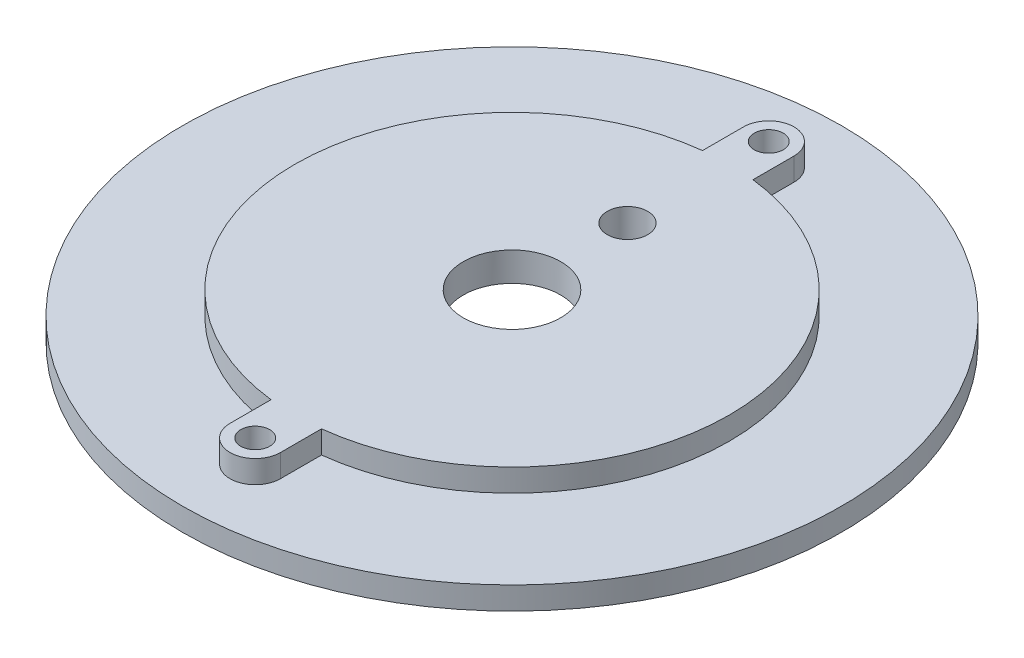
ISO-10303-21;
HEADER;
FILE_DESCRIPTION(('STEP AP214'),'2;1');
FILE_NAME('part.step','',(''),(''),'','','');
FILE_SCHEMA(('AUTOMOTIVE_DESIGN { 1 0 10303 214 1 1 1 1 }'));
ENDSEC;
DATA;
#1=APPLICATION_CONTEXT('core data for automotive mechanical design processes');
#2=APPLICATION_PROTOCOL_DEFINITION('international standard','automotive_design',2000,#1);
#3=PRODUCT_CONTEXT('',#1,'mechanical');
#4=PRODUCT('Part','Part','',(#3));
#5=PRODUCT_RELATED_PRODUCT_CATEGORY('part','',(#4));
#6=PRODUCT_DEFINITION_FORMATION('','',#4);
#7=PRODUCT_DEFINITION_CONTEXT('part definition',#1,'design');
#8=PRODUCT_DEFINITION('design','',#6,#7);
#9=PRODUCT_DEFINITION_SHAPE('','',#8);
#10=(LENGTH_UNIT() NAMED_UNIT(*) SI_UNIT(.MILLI.,.METRE.));
#11=(NAMED_UNIT(*) PLANE_ANGLE_UNIT() SI_UNIT($,.RADIAN.));
#12=(NAMED_UNIT(*) SI_UNIT($,.STERADIAN.) SOLID_ANGLE_UNIT());
#13=UNCERTAINTY_MEASURE_WITH_UNIT(LENGTH_MEASURE(1.E-05),#10,'distance_accuracy_value','');
#14=(GEOMETRIC_REPRESENTATION_CONTEXT(3) GLOBAL_UNCERTAINTY_ASSIGNED_CONTEXT((#13)) GLOBAL_UNIT_ASSIGNED_CONTEXT((#10,
#11,#12)) REPRESENTATION_CONTEXT('',''));
#15=CARTESIAN_POINT('',(0.,0.,0.));
#16=DIRECTION('',(0.,0.,1.));
#17=DIRECTION('',(1.,0.,0.));
#18=AXIS2_PLACEMENT_3D('',#15,#16,#17);
#19=CARTESIAN_POINT('',(0.,-1.961,0.));
#20=DIRECTION('',(0.,1.,0.));
#21=DIRECTION('',(0.,0.,1.));
#22=AXIS2_PLACEMENT_3D('',#19,#20,#21);
#23=CYLINDRICAL_SURFACE('',#22,4.205);
#24=CARTESIAN_POINT('',(0.,1.96,0.));
#25=DIRECTION('',(0.,1.,0.));
#26=DIRECTION('',(0.,0.,1.));
#27=AXIS2_PLACEMENT_3D('',#24,#25,#26);
#28=CIRCLE('',#27,4.205);
#29=CARTESIAN_POINT('',(0.,1.96,4.205));
#30=VERTEX_POINT('',#29);
#31=EDGE_CURVE('E258',#30,#30,#28,.T.);
#32=ORIENTED_EDGE('',*,*,#31,.T.);
#33=EDGE_LOOP('',(#32));
#34=FACE_BOUND('',#33,.T.);
#35=CARTESIAN_POINT('',(0.,-0.54,0.));
#36=DIRECTION('',(0.,-1.,0.));
#37=DIRECTION('',(0.,0.,-1.));
#38=AXIS2_PLACEMENT_3D('',#35,#36,#37);
#39=CIRCLE('',#38,4.205);
#40=CARTESIAN_POINT('',(0.,-0.54,-4.205));
#41=VERTEX_POINT('',#40);
#42=EDGE_CURVE('E42',#41,#41,#39,.F.);
#43=ORIENTED_EDGE('',*,*,#42,.F.);
#44=EDGE_LOOP('',(#43));
#45=FACE_BOUND('',#44,.T.);
#46=ADVANCED_FACE('F38',(#34,#45),#23,.F.);
#47=CARTESIAN_POINT('',(-2.18000000000007,1.96,-22.175));
#48=DIRECTION('',(1.,0.,0.));
#49=DIRECTION('',(0.,0.,-1.));
#50=AXIS2_PLACEMENT_3D('',#47,#48,#49);
#51=PLANE('',#50);
#52=DIRECTION('',(0.,0.,1.));
#53=VECTOR('',#52,1.);
#54=CARTESIAN_POINT('',(-2.18000000000007,1.96,-22.175));
#55=LINE('',#54,#53);
#56=CARTESIAN_POINT('',(-2.18000000000007,1.96,18.6329063755497));
#57=VERTEX_POINT('',#56);
#58=CARTESIAN_POINT('',(-2.18000000000007,1.96,22.175));
#59=VERTEX_POINT('',#58);
#60=EDGE_CURVE('E183',#57,#59,#55,.T.);
#61=ORIENTED_EDGE('',*,*,#60,.F.);
#62=DIRECTION('',(0.,-1.,0.));
#63=VECTOR('',#62,1.);
#64=CARTESIAN_POINT('',(-2.18000000000007,1.96,18.6329063755497));
#65=LINE('',#64,#63);
#66=CARTESIAN_POINT('',(-2.18000000000007,0.,18.6329063755497));
#67=VERTEX_POINT('',#66);
#68=EDGE_CURVE('E130',#57,#67,#65,.T.);
#69=ORIENTED_EDGE('',*,*,#68,.T.);
#70=DIRECTION('',(0.,0.,1.));
#71=VECTOR('',#70,1.);
#72=CARTESIAN_POINT('',(-2.18000000000007,0.,-22.175));
#73=LINE('',#72,#71);
#74=CARTESIAN_POINT('',(-2.18000000000007,0.,22.175));
#75=VERTEX_POINT('',#74);
#76=EDGE_CURVE('E142',#67,#75,#73,.T.);
#77=ORIENTED_EDGE('',*,*,#76,.T.);
#78=DIRECTION('',(0.,-1.,0.));
#79=VECTOR('',#78,1.);
#80=CARTESIAN_POINT('',(-2.18000000000007,1.96,22.175));
#81=LINE('',#80,#79);
#82=EDGE_CURVE('E48',#59,#75,#81,.T.);
#83=ORIENTED_EDGE('',*,*,#82,.F.);
#84=EDGE_LOOP('',(#61,#69,#77,#83));
#85=FACE_BOUND('',#84,.T.);
#86=ADVANCED_FACE('F199',(#85),#51,.F.);
#87=CARTESIAN_POINT('',(2.18000000000007,1.96,22.175));
#88=DIRECTION('',(-1.,0.,0.));
#89=DIRECTION('',(0.,0.,1.));
#90=AXIS2_PLACEMENT_3D('',#87,#88,#89);
#91=PLANE('',#90);
#92=DIRECTION('',(0.,0.,-1.));
#93=VECTOR('',#92,1.);
#94=CARTESIAN_POINT('',(2.18000000000007,1.96,22.175));
#95=LINE('',#94,#93);
#96=CARTESIAN_POINT('',(2.18000000000007,1.96,-18.6329063755497));
#97=VERTEX_POINT('',#96);
#98=CARTESIAN_POINT('',(2.18000000000007,1.96,-22.175));
#99=VERTEX_POINT('',#98);
#100=EDGE_CURVE('E56',#97,#99,#95,.T.);
#101=ORIENTED_EDGE('',*,*,#100,.F.);
#102=DIRECTION('',(0.,-1.,0.));
#103=VECTOR('',#102,1.);
#104=CARTESIAN_POINT('',(2.18000000000007,1.96,-18.6329063755497));
#105=LINE('',#104,#103);
#106=CARTESIAN_POINT('',(2.18000000000007,0.,-18.6329063755497));
#107=VERTEX_POINT('',#106);
#108=EDGE_CURVE('E119',#97,#107,#105,.T.);
#109=ORIENTED_EDGE('',*,*,#108,.T.);
#110=DIRECTION('',(0.,0.,-1.));
#111=VECTOR('',#110,1.);
#112=CARTESIAN_POINT('',(2.18000000000007,0.,22.175));
#113=LINE('',#112,#111);
#114=CARTESIAN_POINT('',(2.18000000000007,0.,-22.175));
#115=VERTEX_POINT('',#114);
#116=EDGE_CURVE('E117',#107,#115,#113,.T.);
#117=ORIENTED_EDGE('',*,*,#116,.T.);
#118=DIRECTION('',(0.,-1.,0.));
#119=VECTOR('',#118,1.);
#120=CARTESIAN_POINT('',(2.18000000000007,1.96,-22.175));
#121=LINE('',#120,#119);
#122=EDGE_CURVE('E106',#99,#115,#121,.T.);
#123=ORIENTED_EDGE('',*,*,#122,.F.);
#124=EDGE_LOOP('',(#101,#109,#117,#123));
#125=FACE_BOUND('',#124,.T.);
#126=ADVANCED_FACE('F118',(#125),#91,.F.);
#127=CARTESIAN_POINT('',(0.,1.96,-22.175));
#128=DIRECTION('',(0.,-1.,0.));
#129=DIRECTION('',(0.,0.,-1.));
#130=AXIS2_PLACEMENT_3D('',#127,#128,#129);
#131=CYLINDRICAL_SURFACE('',#130,2.18000000000007);
#132=CARTESIAN_POINT('',(0.,0.,-22.175));
#133=DIRECTION('',(0.,-1.,0.));
#134=DIRECTION('',(0.,0.,-1.));
#135=AXIS2_PLACEMENT_3D('',#132,#133,#134);
#136=CIRCLE('',#135,2.18000000000007);
#137=CARTESIAN_POINT('',(-2.18000000000007,0.,-22.175));
#138=VERTEX_POINT('',#137);
#139=EDGE_CURVE('E109',#138,#115,#136,.T.);
#140=ORIENTED_EDGE('',*,*,#139,.F.);
#141=DIRECTION('',(0.,-1.,0.));
#142=VECTOR('',#141,1.);
#143=CARTESIAN_POINT('',(-2.18000000000007,1.96,-22.175));
#144=LINE('',#143,#142);
#145=CARTESIAN_POINT('',(-2.18000000000007,1.96,-22.175));
#146=VERTEX_POINT('',#145);
#147=EDGE_CURVE('E11',#146,#138,#144,.T.);
#148=ORIENTED_EDGE('',*,*,#147,.F.);
#149=CARTESIAN_POINT('',(0.,1.96,-22.175));
#150=DIRECTION('',(0.,-1.,0.));
#151=DIRECTION('',(0.,0.,-1.));
#152=AXIS2_PLACEMENT_3D('',#149,#150,#151);
#153=CIRCLE('',#152,2.18000000000007);
#154=EDGE_CURVE('E112',#146,#99,#153,.T.);
#155=ORIENTED_EDGE('',*,*,#154,.T.);
#156=ORIENTED_EDGE('',*,*,#122,.T.);
#157=EDGE_LOOP('',(#140,#148,#155,#156));
#158=FACE_BOUND('',#157,.T.);
#159=ADVANCED_FACE('F40',(#158),#131,.T.);
#160=CARTESIAN_POINT('',(-2.18000000000007,0.,-18.6329063755497));
#161=VERTEX_POINT('',#160);
#162=EDGE_CURVE('E128',#138,#161,#73,.T.);
#163=ORIENTED_EDGE('',*,*,#162,.T.);
#164=DIRECTION('',(0.,-1.,0.));
#165=VECTOR('',#164,1.);
#166=CARTESIAN_POINT('',(-2.18000000000007,1.96,-18.6329063755497));
#167=LINE('',#166,#165);
#168=CARTESIAN_POINT('',(-2.18000000000007,1.96,-18.6329063755497));
#169=VERTEX_POINT('',#168);
#170=EDGE_CURVE('E133',#161,#169,#167,.F.);
#171=ORIENTED_EDGE('',*,*,#170,.T.);
#172=EDGE_CURVE('E115',#146,#169,#55,.T.);
#173=ORIENTED_EDGE('',*,*,#172,.F.);
#174=ORIENTED_EDGE('',*,*,#147,.T.);
#175=EDGE_LOOP('',(#163,#171,#173,#174));
#176=FACE_BOUND('',#175,.T.);
#177=ADVANCED_FACE('F202',(#176),#51,.F.);
#178=CARTESIAN_POINT('',(0.,1.96,22.175));
#179=DIRECTION('',(0.,-1.,0.));
#180=DIRECTION('',(0.,0.,-1.));
#181=AXIS2_PLACEMENT_3D('',#178,#179,#180);
#182=CYLINDRICAL_SURFACE('',#181,2.18000000000007);
#183=CARTESIAN_POINT('',(0.,0.,22.175));
#184=DIRECTION('',(0.,1.,0.));
#185=DIRECTION('',(0.,0.,1.));
#186=AXIS2_PLACEMENT_3D('',#183,#184,#185);
#187=CIRCLE('',#186,2.18000000000007);
#188=CARTESIAN_POINT('',(2.18000000000007,0.,22.175));
#189=VERTEX_POINT('',#188);
#190=EDGE_CURVE('E139',#75,#189,#187,.T.);
#191=ORIENTED_EDGE('',*,*,#190,.T.);
#192=DIRECTION('',(0.,-1.,0.));
#193=VECTOR('',#192,1.);
#194=CARTESIAN_POINT('',(2.18000000000007,1.96,22.175));
#195=LINE('',#194,#193);
#196=CARTESIAN_POINT('',(2.18000000000007,1.96,22.175));
#197=VERTEX_POINT('',#196);
#198=EDGE_CURVE('E114',#197,#189,#195,.T.);
#199=ORIENTED_EDGE('',*,*,#198,.F.);
#200=CARTESIAN_POINT('',(0.,1.96,22.175));
#201=DIRECTION('',(0.,1.,0.));
#202=DIRECTION('',(0.,0.,1.));
#203=AXIS2_PLACEMENT_3D('',#200,#201,#202);
#204=CIRCLE('',#203,2.18000000000007);
#205=EDGE_CURVE('E181',#59,#197,#204,.T.);
#206=ORIENTED_EDGE('',*,*,#205,.F.);
#207=ORIENTED_EDGE('',*,*,#82,.T.);
#208=EDGE_LOOP('',(#191,#199,#206,#207));
#209=FACE_BOUND('',#208,.T.);
#210=ADVANCED_FACE('F200',(#209),#182,.T.);
#211=CARTESIAN_POINT('',(2.18000000000007,0.,18.6329063755497));
#212=VERTEX_POINT('',#211);
#213=EDGE_CURVE('E124',#189,#212,#113,.T.);
#214=ORIENTED_EDGE('',*,*,#213,.T.);
#215=DIRECTION('',(0.,-1.,0.));
#216=VECTOR('',#215,1.);
#217=CARTESIAN_POINT('',(2.18000000000007,1.96,18.6329063755497));
#218=LINE('',#217,#216);
#219=CARTESIAN_POINT('',(2.18000000000007,1.96,18.6329063755497));
#220=VERTEX_POINT('',#219);
#221=EDGE_CURVE('E64',#212,#220,#218,.F.);
#222=ORIENTED_EDGE('',*,*,#221,.T.);
#223=EDGE_CURVE('E153',#197,#220,#95,.T.);
#224=ORIENTED_EDGE('',*,*,#223,.F.);
#225=ORIENTED_EDGE('',*,*,#198,.T.);
#226=EDGE_LOOP('',(#214,#222,#224,#225));
#227=FACE_BOUND('',#226,.T.);
#228=ADVANCED_FACE('F152',(#227),#91,.F.);
#229=CARTESIAN_POINT('',(0.,1.96,-22.175));
#230=DIRECTION('',(0.,-1.,0.));
#231=DIRECTION('',(0.,0.,-1.));
#232=AXIS2_PLACEMENT_3D('',#229,#230,#231);
#233=PLANE('',#232);
#234=ORIENTED_EDGE('',*,*,#31,.F.);
#235=EDGE_LOOP('',(#234));
#236=FACE_BOUND('',#235,.T.);
#237=CARTESIAN_POINT('',(0.,1.96,-9.975));
#238=DIRECTION('',(0.,1.,0.));
#239=DIRECTION('',(0.,0.,1.));
#240=AXIS2_PLACEMENT_3D('',#237,#238,#239);
#241=CIRCLE('',#240,1.75);
#242=CARTESIAN_POINT('',(0.,1.96,-8.225));
#243=VERTEX_POINT('',#242);
#244=EDGE_CURVE('E262',#243,#243,#241,.T.);
#245=ORIENTED_EDGE('',*,*,#244,.F.);
#246=EDGE_LOOP('',(#245));
#247=FACE_BOUND('',#246,.T.);
#248=CARTESIAN_POINT('',(0.,1.96,-22.175));
#249=DIRECTION('',(0.,1.,0.));
#250=DIRECTION('',(0.,0.,1.));
#251=AXIS2_PLACEMENT_3D('',#248,#249,#250);
#252=CIRCLE('',#251,1.25);
#253=CARTESIAN_POINT('',(0.,1.96,-20.925));
#254=VERTEX_POINT('',#253);
#255=EDGE_CURVE('E266',#254,#254,#252,.T.);
#256=ORIENTED_EDGE('',*,*,#255,.F.);
#257=EDGE_LOOP('',(#256));
#258=FACE_BOUND('',#257,.T.);
#259=CARTESIAN_POINT('',(0.,1.96,22.175));
#260=DIRECTION('',(0.,1.,0.));
#261=DIRECTION('',(0.,0.,1.));
#262=AXIS2_PLACEMENT_3D('',#259,#260,#261);
#263=CIRCLE('',#262,1.25);
#264=CARTESIAN_POINT('',(0.,1.96,23.425));
#265=VERTEX_POINT('',#264);
#266=EDGE_CURVE('E269',#265,#265,#263,.T.);
#267=ORIENTED_EDGE('',*,*,#266,.F.);
#268=EDGE_LOOP('',(#267));
#269=FACE_BOUND('',#268,.T.);
#270=ORIENTED_EDGE('',*,*,#172,.T.);
#271=CARTESIAN_POINT('',(0.,1.96,0.));
#272=DIRECTION('',(0.,-1.,0.));
#273=DIRECTION('',(0.,0.,-1.));
#274=AXIS2_PLACEMENT_3D('',#271,#272,#273);
#275=CIRCLE('',#274,18.76);
#276=EDGE_CURVE('E161',#57,#169,#275,.T.);
#277=ORIENTED_EDGE('',*,*,#276,.F.);
#278=ORIENTED_EDGE('',*,*,#60,.T.);
#279=ORIENTED_EDGE('',*,*,#205,.T.);
#280=ORIENTED_EDGE('',*,*,#223,.T.);
#281=EDGE_CURVE('E167',#97,#220,#275,.T.);
#282=ORIENTED_EDGE('',*,*,#281,.F.);
#283=ORIENTED_EDGE('',*,*,#100,.T.);
#284=ORIENTED_EDGE('',*,*,#154,.F.);
#285=EDGE_LOOP('',(#270,#277,#278,#279,#280,#282,#283,#284));
#286=FACE_BOUND('',#285,.T.);
#287=ADVANCED_FACE('F191',(#236,#247,#258,#269,#286),#233,.F.);
#288=CARTESIAN_POINT('',(0.,1.96,0.));
#289=DIRECTION('',(0.,-1.,0.));
#290=DIRECTION('',(0.,0.,-1.));
#291=AXIS2_PLACEMENT_3D('',#288,#289,#290);
#292=CYLINDRICAL_SURFACE('',#291,18.76);
#293=ORIENTED_EDGE('',*,*,#108,.F.);
#294=ORIENTED_EDGE('',*,*,#281,.T.);
#295=ORIENTED_EDGE('',*,*,#221,.F.);
#296=CARTESIAN_POINT('',(0.,0.,0.));
#297=DIRECTION('',(0.,-1.,0.));
#298=DIRECTION('',(0.,0.,-1.));
#299=AXIS2_PLACEMENT_3D('',#296,#297,#298);
#300=CIRCLE('',#299,18.76);
#301=EDGE_CURVE('E158',#107,#212,#300,.T.);
#302=ORIENTED_EDGE('',*,*,#301,.F.);
#303=EDGE_LOOP('',(#293,#294,#295,#302));
#304=FACE_BOUND('',#303,.T.);
#305=ADVANCED_FACE('F248',(#304),#292,.T.);
#306=ORIENTED_EDGE('',*,*,#68,.F.);
#307=ORIENTED_EDGE('',*,*,#276,.T.);
#308=ORIENTED_EDGE('',*,*,#170,.F.);
#309=EDGE_CURVE('E162',#67,#161,#300,.T.);
#310=ORIENTED_EDGE('',*,*,#309,.F.);
#311=EDGE_LOOP('',(#306,#307,#308,#310));
#312=FACE_BOUND('',#311,.T.);
#313=ADVANCED_FACE('F196',(#312),#292,.T.);
#314=CARTESIAN_POINT('',(0.,0.,0.));
#315=DIRECTION('',(0.,-1.,0.));
#316=DIRECTION('',(0.,0.,-1.));
#317=AXIS2_PLACEMENT_3D('',#314,#315,#316);
#318=PLANE('',#317);
#319=CARTESIAN_POINT('',(0.,0.,0.));
#320=DIRECTION('',(0.,-1.,0.));
#321=DIRECTION('',(0.,0.,-1.));
#322=AXIS2_PLACEMENT_3D('',#319,#320,#321);
#323=CIRCLE('',#322,28.4611438053553);
#324=CARTESIAN_POINT('',(0.,0.,-28.4611438053553));
#325=VERTEX_POINT('',#324);
#326=EDGE_CURVE('E285',#325,#325,#323,.T.);
#327=ORIENTED_EDGE('',*,*,#326,.F.);
#328=EDGE_LOOP('',(#327));
#329=FACE_BOUND('',#328,.T.);
#330=ORIENTED_EDGE('',*,*,#116,.F.);
#331=ORIENTED_EDGE('',*,*,#301,.T.);
#332=ORIENTED_EDGE('',*,*,#213,.F.);
#333=ORIENTED_EDGE('',*,*,#190,.F.);
#334=ORIENTED_EDGE('',*,*,#76,.F.);
#335=ORIENTED_EDGE('',*,*,#309,.T.);
#336=ORIENTED_EDGE('',*,*,#162,.F.);
#337=ORIENTED_EDGE('',*,*,#139,.T.);
#338=EDGE_LOOP('',(#330,#331,#332,#333,#334,#335,#336,#337));
#339=FACE_BOUND('',#338,.T.);
#340=ADVANCED_FACE('F126',(#329,#339),#318,.F.);
#341=CARTESIAN_POINT('',(0.,-1.96,0.));
#342=DIRECTION('',(0.,1.,0.));
#343=DIRECTION('',(0.,0.,1.));
#344=AXIS2_PLACEMENT_3D('',#341,#342,#343);
#345=CYLINDRICAL_SURFACE('',#344,28.4611438053553);
#346=CARTESIAN_POINT('',(0.,-1.96,0.));
#347=DIRECTION('',(0.,-1.,0.));
#348=DIRECTION('',(0.,0.,-1.));
#349=AXIS2_PLACEMENT_3D('',#346,#347,#348);
#350=CIRCLE('',#349,28.4611438053553);
#351=CARTESIAN_POINT('',(0.,-1.96,-28.4611438053553));
#352=VERTEX_POINT('',#351);
#353=EDGE_CURVE('E169',#352,#352,#350,.T.);
#354=ORIENTED_EDGE('',*,*,#353,.F.);
#355=EDGE_LOOP('',(#354));
#356=FACE_BOUND('',#355,.T.);
#357=ORIENTED_EDGE('',*,*,#326,.T.);
#358=EDGE_LOOP('',(#357));
#359=FACE_BOUND('',#358,.T.);
#360=ADVANCED_FACE('F238',(#356,#359),#345,.T.);
#361=CARTESIAN_POINT('',(0.,-1.96,0.));
#362=DIRECTION('',(0.,-1.,0.));
#363=DIRECTION('',(0.,0.,-1.));
#364=AXIS2_PLACEMENT_3D('',#361,#362,#363);
#365=PLANE('',#364);
#366=CARTESIAN_POINT('',(0.,-1.96,0.));
#367=DIRECTION('',(0.,-1.,0.));
#368=DIRECTION('',(0.,0.,-1.));
#369=AXIS2_PLACEMENT_3D('',#366,#367,#368);
#370=CIRCLE('',#369,6.75);
#371=CARTESIAN_POINT('',(0.,-1.96,-6.75));
#372=VERTEX_POINT('',#371);
#373=EDGE_CURVE('E301',#372,#372,#370,.T.);
#374=ORIENTED_EDGE('',*,*,#373,.F.);
#375=EDGE_LOOP('',(#374));
#376=FACE_BOUND('',#375,.T.);
#377=CARTESIAN_POINT('',(0.,-1.96,-9.975));
#378=DIRECTION('',(0.,-1.,0.));
#379=DIRECTION('',(0.,0.,-1.));
#380=AXIS2_PLACEMENT_3D('',#377,#378,#379);
#381=CIRCLE('',#380,1.75);
#382=CARTESIAN_POINT('',(0.,-1.96,-11.725));
#383=VERTEX_POINT('',#382);
#384=EDGE_CURVE('E293',#383,#383,#381,.F.);
#385=ORIENTED_EDGE('',*,*,#384,.T.);
#386=EDGE_LOOP('',(#385));
#387=FACE_BOUND('',#386,.T.);
#388=CARTESIAN_POINT('',(0.,-1.96,-22.175));
#389=DIRECTION('',(0.,-1.,0.));
#390=DIRECTION('',(0.,0.,-1.));
#391=AXIS2_PLACEMENT_3D('',#388,#389,#390);
#392=CIRCLE('',#391,1.25);
#393=CARTESIAN_POINT('',(0.,-1.96,-23.425));
#394=VERTEX_POINT('',#393);
#395=EDGE_CURVE('E272',#394,#394,#392,.F.);
#396=ORIENTED_EDGE('',*,*,#395,.T.);
#397=EDGE_LOOP('',(#396));
#398=FACE_BOUND('',#397,.T.);
#399=CARTESIAN_POINT('',(0.,-1.96,22.175));
#400=DIRECTION('',(0.,-1.,0.));
#401=DIRECTION('',(0.,0.,-1.));
#402=AXIS2_PLACEMENT_3D('',#399,#400,#401);
#403=CIRCLE('',#402,1.25);
#404=CARTESIAN_POINT('',(0.,-1.96,20.925));
#405=VERTEX_POINT('',#404);
#406=EDGE_CURVE('E273',#405,#405,#403,.F.);
#407=ORIENTED_EDGE('',*,*,#406,.T.);
#408=EDGE_LOOP('',(#407));
#409=FACE_BOUND('',#408,.T.);
#410=ORIENTED_EDGE('',*,*,#353,.T.);
#411=EDGE_LOOP('',(#410));
#412=FACE_BOUND('',#411,.T.);
#413=ADVANCED_FACE('F234',(#376,#387,#398,#409,#412),#365,.T.);
#414=CARTESIAN_POINT('',(0.,-1.961,22.175));
#415=DIRECTION('',(0.,1.,0.));
#416=DIRECTION('',(0.,0.,1.));
#417=AXIS2_PLACEMENT_3D('',#414,#415,#416);
#418=CYLINDRICAL_SURFACE('',#417,1.25);
#419=ORIENTED_EDGE('',*,*,#406,.F.);
#420=EDGE_LOOP('',(#419));
#421=FACE_BOUND('',#420,.T.);
#422=ORIENTED_EDGE('',*,*,#266,.T.);
#423=EDGE_LOOP('',(#422));
#424=FACE_BOUND('',#423,.T.);
#425=ADVANCED_FACE('F231',(#421,#424),#418,.F.);
#426=CARTESIAN_POINT('',(0.,-1.961,-22.175));
#427=DIRECTION('',(0.,1.,0.));
#428=DIRECTION('',(0.,0.,1.));
#429=AXIS2_PLACEMENT_3D('',#426,#427,#428);
#430=CYLINDRICAL_SURFACE('',#429,1.25);
#431=ORIENTED_EDGE('',*,*,#395,.F.);
#432=EDGE_LOOP('',(#431));
#433=FACE_BOUND('',#432,.T.);
#434=ORIENTED_EDGE('',*,*,#255,.T.);
#435=EDGE_LOOP('',(#434));
#436=FACE_BOUND('',#435,.T.);
#437=ADVANCED_FACE('F227',(#433,#436),#430,.F.);
#438=CARTESIAN_POINT('',(0.,-1.961,-9.975));
#439=DIRECTION('',(0.,1.,0.));
#440=DIRECTION('',(0.,0.,1.));
#441=AXIS2_PLACEMENT_3D('',#438,#439,#440);
#442=CYLINDRICAL_SURFACE('',#441,1.75);
#443=ORIENTED_EDGE('',*,*,#384,.F.);
#444=EDGE_LOOP('',(#443));
#445=FACE_BOUND('',#444,.T.);
#446=ORIENTED_EDGE('',*,*,#244,.T.);
#447=EDGE_LOOP('',(#446));
#448=FACE_BOUND('',#447,.T.);
#449=ADVANCED_FACE('F223',(#445,#448),#442,.F.);
#450=CARTESIAN_POINT('',(0.,-0.54,0.));
#451=DIRECTION('',(0.,-1.,0.));
#452=DIRECTION('',(0.,0.,-1.));
#453=AXIS2_PLACEMENT_3D('',#450,#451,#452);
#454=PLANE('',#453);
#455=CARTESIAN_POINT('',(0.,-0.54,0.));
#456=DIRECTION('',(0.,-1.,0.));
#457=DIRECTION('',(0.,0.,-1.));
#458=AXIS2_PLACEMENT_3D('',#455,#456,#457);
#459=CIRCLE('',#458,6.75);
#460=CARTESIAN_POINT('',(0.,-0.54,-6.75));
#461=VERTEX_POINT('',#460);
#462=EDGE_CURVE('E305',#461,#461,#459,.T.);
#463=ORIENTED_EDGE('',*,*,#462,.T.);
#464=EDGE_LOOP('',(#463));
#465=FACE_BOUND('',#464,.T.);
#466=ORIENTED_EDGE('',*,*,#42,.T.);
#467=EDGE_LOOP('',(#466));
#468=FACE_BOUND('',#467,.T.);
#469=ADVANCED_FACE('F226',(#465,#468),#454,.T.);
#470=CARTESIAN_POINT('',(0.,-0.54,0.));
#471=DIRECTION('',(0.,-1.,0.));
#472=DIRECTION('',(0.,0.,-1.));
#473=AXIS2_PLACEMENT_3D('',#470,#471,#472);
#474=CYLINDRICAL_SURFACE('',#473,6.75);
#475=CARTESIAN_POINT('',(0.,-0.54,-6.75));
#476=CARTESIAN_POINT('',(0.,-0.554791666666667,-6.75));
#477=CARTESIAN_POINT('',(0.,-0.569583333333333,-6.75));
#478=CARTESIAN_POINT('',(0.,-0.599166666666667,-6.75));
#479=CARTESIAN_POINT('',(0.,-0.613958333333333,-6.75));
#480=CARTESIAN_POINT('',(0.,-0.643541666666667,-6.75));
#481=CARTESIAN_POINT('',(0.,-0.658333333333333,-6.75));
#482=CARTESIAN_POINT('',(0.,-0.687916666666667,-6.75));
#483=CARTESIAN_POINT('',(0.,-0.702708333333333,-6.75));
#484=CARTESIAN_POINT('',(0.,-0.732291666666667,-6.75));
#485=CARTESIAN_POINT('',(0.,-0.747083333333333,-6.75));
#486=CARTESIAN_POINT('',(0.,-0.776666666666667,-6.75));
#487=CARTESIAN_POINT('',(0.,-0.791458333333333,-6.75));
#488=CARTESIAN_POINT('',(0.,-0.821041666666667,-6.75));
#489=CARTESIAN_POINT('',(0.,-0.835833333333333,-6.75));
#490=CARTESIAN_POINT('',(0.,-0.865416666666667,-6.75));
#491=CARTESIAN_POINT('',(0.,-0.880208333333333,-6.75));
#492=CARTESIAN_POINT('',(0.,-0.909791666666667,-6.75));
#493=CARTESIAN_POINT('',(0.,-0.924583333333333,-6.75));
#494=CARTESIAN_POINT('',(0.,-0.954166666666666,-6.75));
#495=CARTESIAN_POINT('',(0.,-0.968958333333333,-6.75));
#496=CARTESIAN_POINT('',(0.,-0.998541666666666,-6.75));
#497=CARTESIAN_POINT('',(0.,-1.01333333333333,-6.75));
#498=CARTESIAN_POINT('',(0.,-1.04291666666667,-6.75));
#499=CARTESIAN_POINT('',(0.,-1.05770833333333,-6.75));
#500=CARTESIAN_POINT('',(0.,-1.08729166666667,-6.75));
#501=CARTESIAN_POINT('',(0.,-1.10208333333333,-6.75));
#502=CARTESIAN_POINT('',(0.,-1.13166666666667,-6.75));
#503=CARTESIAN_POINT('',(0.,-1.14645833333333,-6.75));
#504=CARTESIAN_POINT('',(0.,-1.17604166666667,-6.75));
#505=CARTESIAN_POINT('',(0.,-1.19083333333333,-6.75));
#506=CARTESIAN_POINT('',(0.,-1.22041666666667,-6.75));
#507=CARTESIAN_POINT('',(0.,-1.23520833333333,-6.75));
#508=CARTESIAN_POINT('',(0.,-1.26479166666667,-6.75));
#509=CARTESIAN_POINT('',(0.,-1.27958333333333,-6.75));
#510=CARTESIAN_POINT('',(0.,-1.30916666666667,-6.75));
#511=CARTESIAN_POINT('',(0.,-1.32395833333333,-6.75));
#512=CARTESIAN_POINT('',(0.,-1.35354166666667,-6.75));
#513=CARTESIAN_POINT('',(0.,-1.36833333333333,-6.75));
#514=CARTESIAN_POINT('',(0.,-1.39791666666667,-6.75));
#515=CARTESIAN_POINT('',(0.,-1.41270833333333,-6.75));
#516=CARTESIAN_POINT('',(0.,-1.44229166666667,-6.75));
#517=CARTESIAN_POINT('',(0.,-1.45708333333333,-6.75));
#518=CARTESIAN_POINT('',(0.,-1.48666666666667,-6.75));
#519=CARTESIAN_POINT('',(0.,-1.50145833333333,-6.75));
#520=CARTESIAN_POINT('',(0.,-1.53104166666667,-6.75));
#521=CARTESIAN_POINT('',(0.,-1.54583333333333,-6.75));
#522=CARTESIAN_POINT('',(0.,-1.57541666666667,-6.75));
#523=CARTESIAN_POINT('',(0.,-1.59020833333333,-6.75));
#524=CARTESIAN_POINT('',(0.,-1.61979166666667,-6.75));
#525=CARTESIAN_POINT('',(0.,-1.63458333333333,-6.75));
#526=CARTESIAN_POINT('',(0.,-1.66416666666667,-6.75));
#527=CARTESIAN_POINT('',(0.,-1.67895833333333,-6.75));
#528=CARTESIAN_POINT('',(0.,-1.70854166666667,-6.75));
#529=CARTESIAN_POINT('',(0.,-1.72333333333333,-6.75));
#530=CARTESIAN_POINT('',(0.,-1.75291666666667,-6.75));
#531=CARTESIAN_POINT('',(0.,-1.76770833333333,-6.75));
#532=CARTESIAN_POINT('',(0.,-1.79729166666667,-6.75));
#533=CARTESIAN_POINT('',(0.,-1.81208333333333,-6.75));
#534=CARTESIAN_POINT('',(0.,-1.84166666666667,-6.75));
#535=CARTESIAN_POINT('',(0.,-1.85645833333333,-6.75));
#536=CARTESIAN_POINT('',(0.,-1.88604166666667,-6.75));
#537=CARTESIAN_POINT('',(0.,-1.90083333333333,-6.75));
#538=CARTESIAN_POINT('',(0.,-1.93041666666667,-6.75));
#539=CARTESIAN_POINT('',(0.,-1.94520833333333,-6.75));
#540=CARTESIAN_POINT('',(0.,-1.96,-6.75));
#541=B_SPLINE_CURVE_WITH_KNOTS('',3,(#475,#476,#477,#478,#479,#480,#481,#482,#483,#484,#485,
#486,#487,#488,#489,#490,#491,#492,#493,#494,#495,#496,#497,#498,#499,#500,#501,#502,#503,#504,
#505,#506,#507,#508,#509,#510,#511,#512,#513,#514,#515,#516,#517,#518,#519,#520,#521,#522,#523,
#524,#525,#526,#527,#528,#529,#530,#531,#532,#533,#534,#535,#536,#537,#538,#539,#540),
.UNSPECIFIED.,.F.,.F.,(4,2,2,2,2,2,2,2,2,2,2,2,2,2,2,2,2,2,2,2,2,2,2,2,2,2,2,2,2,2,2,2,4),(0.,
0.044375,0.0887500000000001,0.133125,0.1775,0.221875,0.26625,0.310625,0.355,0.399375,0.44375,
0.488125,0.5325,0.576875,0.62125,0.665625,0.71,0.754375,0.79875,0.843125,0.8875,0.931875,
0.97625,1.020625,1.065,1.109375,1.15375,1.198125,1.2425,1.286875,1.33125,1.375625,1.42),.UNSPECIFIED.);
#542=EDGE_CURVE('BSEAM221',#461,#372,#541,.T.);
#543=ORIENTED_EDGE('',*,*,#462,.F.);
#544=ORIENTED_EDGE('',*,*,#373,.T.);
#545=ORIENTED_EDGE('',*,*,#542,.T.);
#546=ORIENTED_EDGE('',*,*,#542,.F.);
#547=EDGE_LOOP('',(#543,#545,#544,#546));
#548=FACE_BOUND('',#547,.T.);
#549=ADVANCED_FACE('F221',(#548),#474,.F.);
#550=CLOSED_SHELL('',(#46,#86,#126,#159,#177,#210,#228,#287,#305,#313,#340,#360,#413,#425,#437,
#449,#469,#549));
#551=MANIFOLD_SOLID_BREP('B2',#550);
#552=ADVANCED_BREP_SHAPE_REPRESENTATION('',(#18,#551),#14);
#553=SHAPE_DEFINITION_REPRESENTATION(#9,#552);
ENDSEC;
END-ISO-10303-21;
